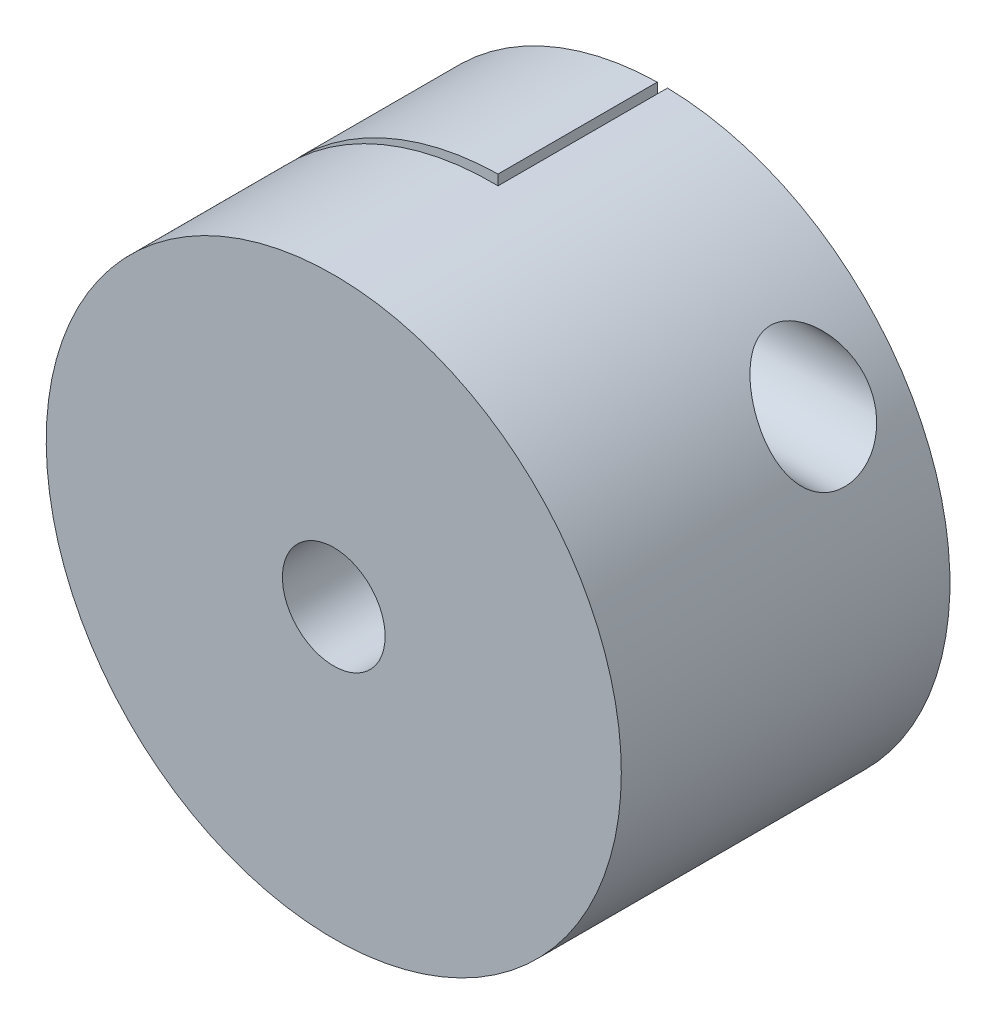
ISO-10303-21;
HEADER;
FILE_DESCRIPTION(('STEP AP214'),'2;1');
FILE_NAME('part.step','',(''),(''),'','','');
FILE_SCHEMA(('AUTOMOTIVE_DESIGN { 1 0 10303 214 1 1 1 1 }'));
ENDSEC;
DATA;
#1=APPLICATION_CONTEXT('core data for automotive mechanical design processes');
#2=APPLICATION_PROTOCOL_DEFINITION('international standard','automotive_design',2000,#1);
#3=PRODUCT_CONTEXT('',#1,'mechanical');
#4=PRODUCT('Part','Part','',(#3));
#5=PRODUCT_RELATED_PRODUCT_CATEGORY('part','',(#4));
#6=PRODUCT_DEFINITION_FORMATION('','',#4);
#7=PRODUCT_DEFINITION_CONTEXT('part definition',#1,'design');
#8=PRODUCT_DEFINITION('design','',#6,#7);
#9=PRODUCT_DEFINITION_SHAPE('','',#8);
#10=(LENGTH_UNIT() NAMED_UNIT(*) SI_UNIT(.MILLI.,.METRE.));
#11=(NAMED_UNIT(*) PLANE_ANGLE_UNIT() SI_UNIT($,.RADIAN.));
#12=(NAMED_UNIT(*) SI_UNIT($,.STERADIAN.) SOLID_ANGLE_UNIT());
#13=UNCERTAINTY_MEASURE_WITH_UNIT(LENGTH_MEASURE(1.E-05),#10,'distance_accuracy_value','');
#14=(GEOMETRIC_REPRESENTATION_CONTEXT(3) GLOBAL_UNCERTAINTY_ASSIGNED_CONTEXT((#13)) GLOBAL_UNIT_ASSIGNED_CONTEXT((#10,
#11,#12)) REPRESENTATION_CONTEXT('',''));
#15=CARTESIAN_POINT('',(0.,0.,0.));
#16=DIRECTION('',(0.,0.,1.));
#17=DIRECTION('',(1.,0.,0.));
#18=AXIS2_PLACEMENT_3D('',#15,#16,#17);
#19=CARTESIAN_POINT('',(0.,0.,16.));
#20=DIRECTION('',(0.,0.,-1.));
#21=DIRECTION('',(-1.,0.,0.));
#22=AXIS2_PLACEMENT_3D('',#19,#20,#21);
#23=CYLINDRICAL_SURFACE('',#22,14.);
#24=CARTESIAN_POINT('',(0.,0.,0.));
#25=DIRECTION('',(0.,0.,1.));
#26=DIRECTION('',(1.,0.,0.));
#27=AXIS2_PLACEMENT_3D('',#24,#25,#26);
#28=CIRCLE('',#27,14.);
#29=CARTESIAN_POINT('',(0.25,-13.9977676791694,0.));
#30=VERTEX_POINT('',#29);
#31=CARTESIAN_POINT('',(0.25,13.9977676791694,0.));
#32=VERTEX_POINT('',#31);
#33=EDGE_CURVE('E132',#30,#32,#28,.T.);
#34=ORIENTED_EDGE('',*,*,#33,.T.);
#35=DIRECTION('',(0.,0.,-1.));
#36=VECTOR('',#35,1.);
#37=CARTESIAN_POINT('',(0.25,13.9977676791694,16.));
#38=LINE('',#37,#36);
#39=CARTESIAN_POINT('',(0.25,13.9977676791694,8.25));
#40=VERTEX_POINT('',#39);
#41=EDGE_CURVE('E111',#32,#40,#38,.F.);
#42=ORIENTED_EDGE('',*,*,#41,.T.);
#43=CARTESIAN_POINT('',(0.,0.,8.25));
#44=DIRECTION('',(0.,0.,1.));
#45=DIRECTION('',(1.,0.,0.));
#46=AXIS2_PLACEMENT_3D('',#43,#44,#45);
#47=CIRCLE('',#46,14.);
#48=CARTESIAN_POINT('',(0.25,-13.9977676791694,8.25));
#49=VERTEX_POINT('',#48);
#50=EDGE_CURVE('E75',#40,#49,#47,.T.);
#51=ORIENTED_EDGE('',*,*,#50,.T.);
#52=DIRECTION('',(0.,0.,-1.));
#53=VECTOR('',#52,1.);
#54=CARTESIAN_POINT('',(0.25,-13.9977676791694,16.));
#55=LINE('',#54,#53);
#56=EDGE_CURVE('E159',#49,#30,#55,.T.);
#57=ORIENTED_EDGE('',*,*,#56,.T.);
#58=EDGE_LOOP('',(#34,#42,#51,#57));
#59=FACE_BOUND('',#58,.T.);
#60=CARTESIAN_POINT('',(0.,0.,16.));
#61=DIRECTION('',(0.,0.,1.));
#62=DIRECTION('',(1.,0.,0.));
#63=AXIS2_PLACEMENT_3D('',#60,#61,#62);
#64=CIRCLE('',#63,14.);
#65=CARTESIAN_POINT('',(14.,0.,16.));
#66=VERTEX_POINT('',#65);
#67=EDGE_CURVE('E130',#66,#66,#64,.T.);
#68=ORIENTED_EDGE('',*,*,#67,.F.);
#69=EDGE_LOOP('',(#68));
#70=FACE_BOUND('',#69,.T.);
#71=CARTESIAN_POINT('',(11.490679359813,7.99776767916942,6.5));
#72=CARTESIAN_POINT('',(11.5516656594137,7.91014606887652,6.49999977427061));
#73=CARTESIAN_POINT('',(11.6116583436791,7.82180919120801,6.49539303561917));
#74=CARTESIAN_POINT('',(11.7291450925166,7.64450565599221,6.47652064536594));
#75=CARTESIAN_POINT('',(11.7866392770675,7.55553902892478,6.46225545811235));
#76=CARTESIAN_POINT('',(11.8986790569685,7.37783618930757,6.42362377017787));
#77=CARTESIAN_POINT('',(11.9532229123917,7.28910014147872,6.39925138073861));
#78=CARTESIAN_POINT('',(12.0587890551472,7.11309695671485,6.34008118658348));
#79=CARTESIAN_POINT('',(12.1098132550163,7.02582904182223,6.30528909958802));
#80=CARTESIAN_POINT('',(12.2286390542672,6.8176328672165,6.20804281135958));
#81=CARTESIAN_POINT('',(12.2944319648484,6.69804424432183,6.14011125189402));
#82=CARTESIAN_POINT('',(12.4166200693322,6.46872860623871,5.98276428563153));
#83=CARTESIAN_POINT('',(12.4730246460502,6.3589917961842,5.89337054936041));
#84=CARTESIAN_POINT('',(12.5757346619295,6.15338837926624,5.69377739140728));
#85=CARTESIAN_POINT('',(12.6219873460278,6.0575950591131,5.58347459152025));
#86=CARTESIAN_POINT('',(12.7032432320941,5.88529806376817,5.34502176678515));
#87=CARTESIAN_POINT('',(12.7382486976531,5.80879050783358,5.21687534055776));
#88=CARTESIAN_POINT('',(12.7939289894745,5.68503129348182,4.95907383654407));
#89=CARTESIAN_POINT('',(12.8156138307096,5.63575898623461,4.83060421165262));
#90=CARTESIAN_POINT('',(12.8491716235662,5.55882843847037,4.5661416328464));
#91=CARTESIAN_POINT('',(12.8610483852078,5.531161805299,4.43015162220438));
#92=CARTESIAN_POINT('',(12.8745705603,5.49960965337461,4.16244776124576));
#93=CARTESIAN_POINT('',(12.8767347124105,5.4945185890745,4.03090056861671));
#94=CARTESIAN_POINT('',(12.8722443335233,5.50503040803543,3.76879895536095));
#95=CARTESIAN_POINT('',(12.8655911203334,5.5206301989249,3.638244389313));
#96=CARTESIAN_POINT('',(12.8436379237383,5.57150857110303,3.38364269854005));
#97=CARTESIAN_POINT('',(12.8284556161979,5.60651925614825,3.25953160763476));
#98=CARTESIAN_POINT('',(12.7896035677863,5.69458881709802,3.01931980347134));
#99=CARTESIAN_POINT('',(12.7659337068456,5.74764794832498,2.90321920356161));
#100=CARTESIAN_POINT('',(12.7097692219042,5.87080982317001,2.67992394589161));
#101=CARTESIAN_POINT('',(12.6771225980287,5.94120372309579,2.57292856441977));
#102=CARTESIAN_POINT('',(12.60353926892,6.09574504273581,2.37263332134107));
#103=CARTESIAN_POINT('',(12.5626012245077,6.17989468376852,2.27933567631233));
#104=CARTESIAN_POINT('',(12.470523962514,6.36373595678701,2.10342804494597));
#105=CARTESIAN_POINT('',(12.4189535277045,6.464021173486,2.02166627585752));
#106=CARTESIAN_POINT('',(12.3079816683031,6.6728991591424,1.87610016784093));
#107=CARTESIAN_POINT('',(12.2485775893457,6.78149473873935,1.81230193878533));
#108=CARTESIAN_POINT('',(12.1166782120661,7.01468092040007,1.69737884724094));
#109=CARTESIAN_POINT('',(12.0434691316834,7.13979080554245,1.64813337765568));
#110=CARTESIAN_POINT('',(11.8901702654704,7.39227392218546,1.57083600729054));
#111=CARTESIAN_POINT('',(11.8100772015483,7.51964820881863,1.54279426650651));
#112=CARTESIAN_POINT('',(11.6325437876849,7.79191550970663,1.50417415204731));
#113=CARTESIAN_POINT('',(11.5342642343268,7.93669672006801,1.49668298741879));
#114=CARTESIAN_POINT('',(11.3327181073019,8.22192694311646,1.505977495735));
#115=CARTESIAN_POINT('',(11.229448361156,8.3623731043365,1.52277881405532));
#116=CARTESIAN_POINT('',(11.003178215464,8.65852788656441,1.58343584746153));
#117=CARTESIAN_POINT('',(10.8796771437855,8.81305523550111,1.63121038483806));
#118=CARTESIAN_POINT('',(10.6322438427212,9.11003756455905,1.75527442930803));
#119=CARTESIAN_POINT('',(10.5083113512405,9.25248298610465,1.83158626013388));
#120=CARTESIAN_POINT('',(10.2741113434714,9.51160802947413,2.00484993140763));
#121=CARTESIAN_POINT('',(10.1635415975784,9.62943617707022,2.09967397241966));
#122=CARTESIAN_POINT('',(9.95040854961326,9.84950142055011,2.31341803480738));
#123=CARTESIAN_POINT('',(9.84783210231968,9.95176438971519,2.43229728662166));
#124=CARTESIAN_POINT('',(9.68803253788483,10.1069416056333,2.65338353815194));
#125=CARTESIAN_POINT('',(9.62675277619245,10.1652132046545,2.74889220979241));
#126=CARTESIAN_POINT('',(9.51463875715464,10.2702248931958,2.95170269450118));
#127=CARTESIAN_POINT('',(9.46378804645504,10.3169831704151,3.05898551510927));
#128=CARTESIAN_POINT('',(9.38539865707228,10.3882887046595,3.26204362547364));
#129=CARTESIAN_POINT('',(9.35523767402674,10.4154007174676,3.35589077535247));
#130=CARTESIAN_POINT('',(9.30676259862039,10.4587398835682,3.5490243244324));
#131=CARTESIAN_POINT('',(9.28843716058832,10.4749774617551,3.64830541524889));
#132=CARTESIAN_POINT('',(9.26540924170529,10.4953535772014,3.85028843754386));
#133=CARTESIAN_POINT('',(9.26078432571755,10.4994232275111,3.95300652916053));
#134=CARTESIAN_POINT('',(9.26592762257144,10.4948842005682,4.15779868241144));
#135=CARTESIAN_POINT('',(9.27569696033032,10.4862745324213,4.25987269308438));
#136=CARTESIAN_POINT('',(9.30712051026686,10.4583883379419,4.45160794560922));
#137=CARTESIAN_POINT('',(9.32770904072049,10.4400671623926,4.54159217771498));
#138=CARTESIAN_POINT('',(9.37834434930877,10.3946050589235,4.71648350887695));
#139=CARTESIAN_POINT('',(9.40839550926472,10.367460044796,4.80138823406757));
#140=CARTESIAN_POINT('',(9.49239223985164,10.2907266887185,5.00456106869));
#141=CARTESIAN_POINT('',(9.55087952205689,10.2366225502855,5.11924457311828));
#142=CARTESIAN_POINT('',(9.67919210954529,10.1153882900802,5.33455283214644));
#143=CARTESIAN_POINT('',(9.74904599826674,10.0482252440454,5.4351409224998));
#144=CARTESIAN_POINT('',(9.92532515621357,9.8746444814084,5.65973697161649));
#145=CARTESIAN_POINT('',(10.035243095848,9.7632405124862,5.77713961642322));
#146=CARTESIAN_POINT('',(10.2621216180487,9.52450134695279,5.9860208119408));
#147=CARTESIAN_POINT('',(10.3790919446213,9.3971438336171,6.07746244987957));
#148=CARTESIAN_POINT('',(10.6183064463305,9.12606542907405,6.23657037082035));
#149=CARTESIAN_POINT('',(10.7406093284653,8.98201448888971,6.30358352087646));
#150=CARTESIAN_POINT('',(10.9836060445354,8.68316219158734,6.40940897590127));
#151=CARTESIAN_POINT('',(11.1043033747767,8.52839144239665,6.44829821764277));
#152=CARTESIAN_POINT('',(11.268054353382,8.30883770751086,6.4813371586051));
#153=CARTESIAN_POINT('',(11.3131593009052,8.24731960583774,6.4882906439976));
#154=CARTESIAN_POINT('',(11.4025740453025,8.12324722986067,6.49762465794899));
#155=CARTESIAN_POINT('',(11.4468829157137,8.0606918930046,6.50000016210435));
#156=CARTESIAN_POINT('',(11.490679359813,7.99776767916942,6.5));
#157=B_SPLINE_CURVE_WITH_KNOTS('',3,(#71,#72,#73,#74,#75,#76,#77,#78,#79,#80,#81,#82,#83,#84,
#85,#86,#87,#88,#89,#90,#91,#92,#93,#94,#95,#96,#97,#98,#99,#100,#101,#102,#103,#104,#105,#106,
#107,#108,#109,#110,#111,#112,#113,#114,#115,#116,#117,#118,#119,#120,#121,#122,#123,#124,#125,
#126,#127,#128,#129,#130,#131,#132,#133,#134,#135,#136,#137,#138,#139,#140,#141,#142,#143,#144,
#145,#146,#147,#148,#149,#150,#151,#152,#153,#154,#155,#156),.UNSPECIFIED.,.T.,.F.,(4,2,2,2,2,2,
2,2,2,2,2,2,2,2,2,2,2,2,2,2,2,2,2,2,2,2,2,2,2,2,2,2,2,2,2,2,2,2,2,2,2,2,4),(0.,
0.320183643268509,0.640351894195072,0.960706947386618,1.28088652956916,1.73620817337135,
2.19107199470473,2.64824634716572,3.10532863198247,3.52105665322652,3.93662310582452,
4.3297081682848,4.72273448846018,5.11046689082658,5.4982047784791,5.89296199426746,
6.28778301972679,6.70390588940507,7.12017012291831,7.57763535541176,8.03531964865485,
8.55874932210159,9.0825162563604,9.69057509806223,10.2991106014745,10.8591819843958,
11.4183119729261,11.7998421925637,12.1807657819949,12.4862577053998,12.7914563448307,
13.0983795808129,13.4053268042532,13.6865263227205,13.9678562470705,14.3844403354132,
14.8020886676371,15.3859084256891,15.9705541800215,16.569849030842,17.1674981627527,
17.3971815567988,17.6271168885989),.UNSPECIFIED.);
#158=CARTESIAN_POINT('',(11.490679359813,7.99776767916942,6.5));
#159=VERTEX_POINT('',#158);
#160=EDGE_CURVE('E57',#159,#159,#157,.T.);
#161=ORIENTED_EDGE('',*,*,#160,.F.);
#162=EDGE_LOOP('',(#161));
#163=FACE_BOUND('',#162,.T.);
#164=ADVANCED_FACE('F53',(#59,#70,#163),#23,.T.);
#165=CARTESIAN_POINT('',(-14.,7.99776767916942,4.));
#166=DIRECTION('',(1.,0.,0.));
#167=DIRECTION('',(0.,0.,-1.));
#168=AXIS2_PLACEMENT_3D('',#165,#166,#167);
#169=CYLINDRICAL_SURFACE('',#168,1.5);
#170=CARTESIAN_POINT('',(0.25,7.99776767916942,4.));
#171=DIRECTION('',(1.,0.,0.));
#172=DIRECTION('',(0.,0.,-1.));
#173=AXIS2_PLACEMENT_3D('',#170,#171,#172);
#174=CIRCLE('',#173,1.5);
#175=CARTESIAN_POINT('',(0.25,7.99776767916942,2.5));
#176=VERTEX_POINT('',#175);
#177=EDGE_CURVE('E133',#176,#176,#174,.T.);
#178=ORIENTED_EDGE('',*,*,#177,.F.);
#179=EDGE_LOOP('',(#178));
#180=FACE_BOUND('',#179,.T.);
#181=CARTESIAN_POINT('',(3.,7.99776767916942,4.));
#182=DIRECTION('',(1.,0.,0.));
#183=DIRECTION('',(0.,0.,-1.));
#184=AXIS2_PLACEMENT_3D('',#181,#182,#183);
#185=CIRCLE('',#184,1.5);
#186=CARTESIAN_POINT('',(3.,7.99776767916942,2.5));
#187=VERTEX_POINT('',#186);
#188=EDGE_CURVE('E146',#187,#187,#185,.T.);
#189=ORIENTED_EDGE('',*,*,#188,.T.);
#190=EDGE_LOOP('',(#189));
#191=FACE_BOUND('',#190,.T.);
#192=ADVANCED_FACE('F183',(#180,#191),#169,.F.);
#193=CARTESIAN_POINT('',(0.,0.,16.));
#194=DIRECTION('',(0.,0.,1.));
#195=DIRECTION('',(1.,0.,0.));
#196=AXIS2_PLACEMENT_3D('',#193,#194,#195);
#197=PLANE('',#196);
#198=ORIENTED_EDGE('',*,*,#67,.T.);
#199=EDGE_LOOP('',(#198));
#200=FACE_BOUND('',#199,.T.);
#201=CARTESIAN_POINT('',(0.,0.,16.));
#202=DIRECTION('',(0.,0.,1.));
#203=DIRECTION('',(1.,0.,0.));
#204=AXIS2_PLACEMENT_3D('',#201,#202,#203);
#205=CIRCLE('',#204,2.5);
#206=CARTESIAN_POINT('',(2.5,0.,16.));
#207=VERTEX_POINT('',#206);
#208=EDGE_CURVE('E117',#207,#207,#205,.T.);
#209=ORIENTED_EDGE('',*,*,#208,.F.);
#210=EDGE_LOOP('',(#209));
#211=FACE_BOUND('',#210,.T.);
#212=ADVANCED_FACE('F187',(#200,#211),#197,.T.);
#213=CARTESIAN_POINT('',(0.,0.,0.));
#214=DIRECTION('',(0.,0.,1.));
#215=DIRECTION('',(1.,0.,0.));
#216=AXIS2_PLACEMENT_3D('',#213,#214,#215);
#217=PLANE('',#216);
#218=ORIENTED_EDGE('',*,*,#33,.F.);
#219=DIRECTION('',(0.,1.,0.));
#220=VECTOR('',#219,1.);
#221=CARTESIAN_POINT('',(0.25,-14.,0.));
#222=LINE('',#221,#220);
#223=CARTESIAN_POINT('',(0.25,-2.48746859276655,0.));
#224=VERTEX_POINT('',#223);
#225=EDGE_CURVE('E82',#30,#224,#222,.T.);
#226=ORIENTED_EDGE('',*,*,#225,.T.);
#227=CARTESIAN_POINT('',(0.,0.,0.));
#228=DIRECTION('',(0.,0.,1.));
#229=DIRECTION('',(1.,0.,0.));
#230=AXIS2_PLACEMENT_3D('',#227,#228,#229);
#231=CIRCLE('',#230,2.5);
#232=CARTESIAN_POINT('',(0.25,2.48746859276655,0.));
#233=VERTEX_POINT('',#232);
#234=EDGE_CURVE('E118',#224,#233,#231,.T.);
#235=ORIENTED_EDGE('',*,*,#234,.T.);
#236=EDGE_CURVE('E107',#233,#32,#222,.T.);
#237=ORIENTED_EDGE('',*,*,#236,.T.);
#238=EDGE_LOOP('',(#218,#226,#235,#237));
#239=FACE_BOUND('',#238,.T.);
#240=ADVANCED_FACE('F55',(#239),#217,.F.);
#241=CARTESIAN_POINT('',(0.,0.,16.));
#242=DIRECTION('',(0.,0.,-1.));
#243=DIRECTION('',(-1.,0.,0.));
#244=AXIS2_PLACEMENT_3D('',#241,#242,#243);
#245=CYLINDRICAL_SURFACE('',#244,2.5);
#246=DIRECTION('',(0.,0.,-1.));
#247=VECTOR('',#246,1.);
#248=CARTESIAN_POINT('',(0.25,-2.48746859276655,16.));
#249=LINE('',#248,#247);
#250=CARTESIAN_POINT('',(0.25,-2.48746859276655,8.25));
#251=VERTEX_POINT('',#250);
#252=EDGE_CURVE('E12',#251,#224,#249,.T.);
#253=ORIENTED_EDGE('',*,*,#252,.F.);
#254=CARTESIAN_POINT('',(0.,0.,8.25));
#255=DIRECTION('',(0.,0.,1.));
#256=DIRECTION('',(1.,0.,0.));
#257=AXIS2_PLACEMENT_3D('',#254,#255,#256);
#258=CIRCLE('',#257,2.5);
#259=CARTESIAN_POINT('',(0.25,2.48746859276655,8.25));
#260=VERTEX_POINT('',#259);
#261=EDGE_CURVE('E96',#260,#251,#258,.T.);
#262=ORIENTED_EDGE('',*,*,#261,.F.);
#263=DIRECTION('',(0.,0.,-1.));
#264=VECTOR('',#263,1.);
#265=CARTESIAN_POINT('',(0.25,2.48746859276655,16.));
#266=LINE('',#265,#264);
#267=EDGE_CURVE('E110',#233,#260,#266,.F.);
#268=ORIENTED_EDGE('',*,*,#267,.F.);
#269=ORIENTED_EDGE('',*,*,#234,.F.);
#270=EDGE_LOOP('',(#253,#262,#268,#269));
#271=FACE_BOUND('',#270,.T.);
#272=ORIENTED_EDGE('',*,*,#208,.T.);
#273=EDGE_LOOP('',(#272));
#274=FACE_BOUND('',#273,.T.);
#275=ADVANCED_FACE('F123',(#271,#274),#245,.F.);
#276=CARTESIAN_POINT('',(-14.,-14.,8.25));
#277=DIRECTION('',(0.,0.,1.));
#278=DIRECTION('',(1.,0.,0.));
#279=AXIS2_PLACEMENT_3D('',#276,#277,#278);
#280=PLANE('',#279);
#281=DIRECTION('',(0.,1.,0.));
#282=VECTOR('',#281,1.);
#283=CARTESIAN_POINT('',(0.25,-14.,8.25));
#284=LINE('',#283,#282);
#285=EDGE_CURVE('E100',#260,#40,#284,.T.);
#286=ORIENTED_EDGE('',*,*,#285,.F.);
#287=ORIENTED_EDGE('',*,*,#261,.T.);
#288=EDGE_CURVE('E67',#49,#251,#284,.T.);
#289=ORIENTED_EDGE('',*,*,#288,.F.);
#290=ORIENTED_EDGE('',*,*,#50,.F.);
#291=EDGE_LOOP('',(#286,#287,#289,#290));
#292=FACE_BOUND('',#291,.T.);
#293=ADVANCED_FACE('F172',(#292),#280,.F.);
#294=CARTESIAN_POINT('',(0.25,-14.,8.25));
#295=DIRECTION('',(1.,0.,0.));
#296=DIRECTION('',(0.,0.,-1.));
#297=AXIS2_PLACEMENT_3D('',#294,#295,#296);
#298=PLANE('',#297);
#299=ORIENTED_EDGE('',*,*,#177,.T.);
#300=EDGE_LOOP('',(#299));
#301=FACE_BOUND('',#300,.T.);
#302=ORIENTED_EDGE('',*,*,#236,.F.);
#303=ORIENTED_EDGE('',*,*,#267,.T.);
#304=ORIENTED_EDGE('',*,*,#285,.T.);
#305=ORIENTED_EDGE('',*,*,#41,.F.);
#306=EDGE_LOOP('',(#302,#303,#304,#305));
#307=FACE_BOUND('',#306,.T.);
#308=ADVANCED_FACE('F109',(#301,#307),#298,.F.);
#309=ORIENTED_EDGE('',*,*,#288,.T.);
#310=ORIENTED_EDGE('',*,*,#252,.T.);
#311=ORIENTED_EDGE('',*,*,#225,.F.);
#312=ORIENTED_EDGE('',*,*,#56,.F.);
#313=EDGE_LOOP('',(#309,#310,#311,#312));
#314=FACE_BOUND('',#313,.T.);
#315=ADVANCED_FACE('F171',(#314),#298,.F.);
#316=CARTESIAN_POINT('',(14.,7.99776767916942,4.));
#317=DIRECTION('',(-1.,0.,0.));
#318=DIRECTION('',(0.,0.,1.));
#319=AXIS2_PLACEMENT_3D('',#316,#317,#318);
#320=CYLINDRICAL_SURFACE('',#319,2.5);
#321=CARTESIAN_POINT('',(3.,7.99776767916942,4.));
#322=DIRECTION('',(1.,0.,0.));
#323=DIRECTION('',(0.,0.,-1.));
#324=AXIS2_PLACEMENT_3D('',#321,#322,#323);
#325=CIRCLE('',#324,2.5);
#326=CARTESIAN_POINT('',(3.,7.99776767916942,1.5));
#327=VERTEX_POINT('',#326);
#328=EDGE_CURVE('E141',#327,#327,#325,.T.);
#329=ORIENTED_EDGE('',*,*,#328,.F.);
#330=EDGE_LOOP('',(#329));
#331=FACE_BOUND('',#330,.T.);
#332=ORIENTED_EDGE('',*,*,#160,.T.);
#333=EDGE_LOOP('',(#332));
#334=FACE_BOUND('',#333,.T.);
#335=ADVANCED_FACE('F193',(#331,#334),#320,.F.);
#336=CARTESIAN_POINT('',(3.,7.99776767916942,4.));
#337=DIRECTION('',(1.,0.,0.));
#338=DIRECTION('',(0.,0.,-1.));
#339=AXIS2_PLACEMENT_3D('',#336,#337,#338);
#340=PLANE('',#339);
#341=ORIENTED_EDGE('',*,*,#328,.T.);
#342=EDGE_LOOP('',(#341));
#343=FACE_BOUND('',#342,.T.);
#344=ORIENTED_EDGE('',*,*,#188,.F.);
#345=EDGE_LOOP('',(#344));
#346=FACE_BOUND('',#345,.T.);
#347=ADVANCED_FACE('F197',(#343,#346),#340,.T.);
#348=CLOSED_SHELL('',(#164,#192,#212,#240,#275,#293,#308,#315,#335,#347));
#349=MANIFOLD_SOLID_BREP('B2',#348);
#350=CARTESIAN_POINT('',(0.,0.,16.));
#351=DIRECTION('',(0.,0.,-1.));
#352=DIRECTION('',(-1.,0.,0.));
#353=AXIS2_PLACEMENT_3D('',#350,#351,#352);
#354=CYLINDRICAL_SURFACE('',#353,2.5);
#355=DIRECTION('',(0.,0.,-1.));
#356=VECTOR('',#355,1.);
#357=CARTESIAN_POINT('',(-0.249999999999999,2.48746859276655,16.));
#358=LINE('',#357,#356);
#359=CARTESIAN_POINT('',(-0.249999999999999,2.48746859276655,7.75));
#360=VERTEX_POINT('',#359);
#361=CARTESIAN_POINT('',(-0.25,2.48746859276655,0.));
#362=VERTEX_POINT('',#361);
#363=EDGE_CURVE('E51',#360,#362,#358,.T.);
#364=ORIENTED_EDGE('',*,*,#363,.F.);
#365=CARTESIAN_POINT('',(0.,0.,7.75));
#366=DIRECTION('',(0.,0.,-1.));
#367=DIRECTION('',(-1.,0.,0.));
#368=AXIS2_PLACEMENT_3D('',#365,#366,#367);
#369=CIRCLE('',#368,2.5);
#370=CARTESIAN_POINT('',(-0.249999999999999,-2.48746859276655,7.75));
#371=VERTEX_POINT('',#370);
#372=EDGE_CURVE('E298',#371,#360,#369,.T.);
#373=ORIENTED_EDGE('',*,*,#372,.F.);
#374=DIRECTION('',(0.,0.,-1.));
#375=VECTOR('',#374,1.);
#376=CARTESIAN_POINT('',(-0.249999999999999,-2.48746859276655,16.));
#377=LINE('',#376,#375);
#378=CARTESIAN_POINT('',(-0.25,-2.48746859276655,0.));
#379=VERTEX_POINT('',#378);
#380=EDGE_CURVE('E347',#379,#371,#377,.F.);
#381=ORIENTED_EDGE('',*,*,#380,.F.);
#382=CARTESIAN_POINT('',(0.,0.,0.));
#383=DIRECTION('',(0.,0.,1.));
#384=DIRECTION('',(1.,0.,0.));
#385=AXIS2_PLACEMENT_3D('',#382,#383,#384);
#386=CIRCLE('',#385,2.5);
#387=EDGE_CURVE('E343',#362,#379,#386,.T.);
#388=ORIENTED_EDGE('',*,*,#387,.F.);
#389=EDGE_LOOP('',(#364,#373,#381,#388));
#390=FACE_BOUND('',#389,.T.);
#391=ADVANCED_FACE('F288',(#390),#354,.F.);
#392=CARTESIAN_POINT('',(0.,0.,16.));
#393=DIRECTION('',(0.,0.,-1.));
#394=DIRECTION('',(-1.,0.,0.));
#395=AXIS2_PLACEMENT_3D('',#392,#393,#394);
#396=CYLINDRICAL_SURFACE('',#395,14.);
#397=CARTESIAN_POINT('',(-11.490679359813,7.99776767916942,2.5));
#398=CARTESIAN_POINT('',(-11.4179331705252,8.10228251228951,2.50000043473908));
#399=CARTESIAN_POINT('',(-11.3437427712539,8.20580582956691,2.51091197034802));
#400=CARTESIAN_POINT('',(-11.194641874841,8.40808045898997,2.55350594783422));
#401=CARTESIAN_POINT('',(-11.1197306717029,8.50682636378036,2.58521136095123));
#402=CARTESIAN_POINT('',(-10.9717025303421,8.69691099418625,2.66883744956241));
#403=CARTESIAN_POINT('',(-10.8985861089538,8.78824760323684,2.72076387706085));
#404=CARTESIAN_POINT('',(-10.7574162030731,8.96048655226909,2.84483802733673));
#405=CARTESIAN_POINT('',(-10.6893526176702,9.04140996025172,2.91694395311992));
#406=CARTESIAN_POINT('',(-10.5843520031706,9.16382348645025,3.05361397447309));
#407=CARTESIAN_POINT('',(-10.544682395853,9.20938437318157,3.11245545579624));
#408=CARTESIAN_POINT('',(-10.4714626189687,9.29255197861002,3.23892265967011));
#409=CARTESIAN_POINT('',(-10.4379026752949,9.33017141752627,3.30653405016461));
#410=CARTESIAN_POINT('',(-10.3845493115163,9.38948540782105,3.43673695201789));
#411=CARTESIAN_POINT('',(-10.3633616733568,9.4128326871136,3.49799807036351));
#412=CARTESIAN_POINT('',(-10.3279936874624,9.45162631201994,3.62491746564926));
#413=CARTESIAN_POINT('',(-10.3138086341291,9.46707796358497,3.69057275601149));
#414=CARTESIAN_POINT('',(-10.2935604929701,9.48909089428347,3.82502102604751));
#415=CARTESIAN_POINT('',(-10.2875454060973,9.49559963374782,3.89383011488929));
#416=CARTESIAN_POINT('',(-10.2843912867214,9.49901593765675,4.03188746724893));
#417=CARTESIAN_POINT('',(-10.2872501135025,9.49592581770056,4.10113562082614));
#418=CARTESIAN_POINT('',(-10.3008583473552,9.48116018316584,4.23112398092475));
#419=CARTESIAN_POINT('',(-10.3108317571619,9.47032881242325,4.29204715157822));
#420=CARTESIAN_POINT('',(-10.3370439015046,9.44171049554827,4.41080753666845));
#421=CARTESIAN_POINT('',(-10.353283780578,9.42392227877676,4.46864418517037));
#422=CARTESIAN_POINT('',(-10.3923552685729,9.38082348973207,4.58414001326673));
#423=CARTESIAN_POINT('',(-10.4155686378421,9.35507361427678,4.64150353394592));
#424=CARTESIAN_POINT('',(-10.4667769621284,9.29774499981334,4.75092086602498));
#425=CARTESIAN_POINT('',(-10.4947756228409,9.26616174193517,4.80297051212272));
#426=CARTESIAN_POINT('',(-10.570229328823,9.18014185107555,4.92756023347018));
#427=CARTESIAN_POINT('',(-10.6201434091725,9.12245222306357,4.99638017926407));
#428=CARTESIAN_POINT('',(-10.7253991613595,8.99846973109727,5.12086612172606));
#429=CARTESIAN_POINT('',(-10.7807503936029,8.93216164428054,5.1765083396901));
#430=CARTESIAN_POINT('',(-10.8956038661925,8.79171119317087,5.27560332225408));
#431=CARTESIAN_POINT('',(-10.9551624300202,8.71745045550524,5.31882166016195));
#432=CARTESIAN_POINT('',(-11.0757314063156,8.56374501150859,5.39172774632739));
#433=CARTESIAN_POINT('',(-11.1367415171343,8.48430137637025,5.42141828042508));
#434=CARTESIAN_POINT('',(-11.2707648137626,8.3056968635891,5.47152124659353));
#435=CARTESIAN_POINT('',(-11.3437988312124,8.20571183270692,5.48899571649325));
#436=CARTESIAN_POINT('',(-11.487912428622,8.00271069892993,5.50344125941125));
#437=CARTESIAN_POINT('',(-11.5589900611139,7.89969177306738,5.50039259483316));
#438=CARTESIAN_POINT('',(-11.6976084363918,7.69295479717623,5.472431192496));
#439=CARTESIAN_POINT('',(-11.7651174428816,7.58923752741813,5.44734892652965));
#440=CARTESIAN_POINT('',(-11.8936448079312,7.3861746209804,5.37388286595137));
#441=CARTESIAN_POINT('',(-11.9546763938698,7.28682032803338,5.32554771828303));
#442=CARTESIAN_POINT('',(-12.051945498388,7.12439098228816,5.2221758972293));
#443=CARTESIAN_POINT('',(-12.0903343862386,7.05895967857897,5.1728269830232));
#444=CARTESIAN_POINT('',(-12.1615861276621,6.93548033891278,5.06226081191781));
#445=CARTESIAN_POINT('',(-12.1944518213362,6.87742851209303,5.00104968980834));
#446=CARTESIAN_POINT('',(-12.2538830955826,6.77097506136821,4.86736477475574));
#447=CARTESIAN_POINT('',(-12.2804113462377,6.72263087273032,4.79482821735036));
#448=CARTESIAN_POINT('',(-12.3260343393124,6.63861273681669,4.64061840210928));
#449=CARTESIAN_POINT('',(-12.3451327356984,6.60293256219868,4.55894966094469));
#450=CARTESIAN_POINT('',(-12.3736193066078,6.54937932336721,4.39821684273215));
#451=CARTESIAN_POINT('',(-12.3838201741653,6.53002322819768,4.31978911896731));
#452=CARTESIAN_POINT('',(-12.3974177785559,6.50417201187225,4.16027828577922));
#453=CARTESIAN_POINT('',(-12.4008178840043,6.49767052347392,4.07919651122364));
#454=CARTESIAN_POINT('',(-12.4007178534466,6.49786047505432,3.9225798628851));
#455=CARTESIAN_POINT('',(-12.3976700770702,6.50368702826499,3.84704175866509));
#456=CARTESIAN_POINT('',(-12.3856647835023,6.52652069114148,3.69817038503741));
#457=CARTESIAN_POINT('',(-12.3767079602769,6.54352648790162,3.62483685777867));
#458=CARTESIAN_POINT('',(-12.3531656467647,6.58786153588353,3.482604970008));
#459=CARTESIAN_POINT('',(-12.3385987334383,6.61515670914554,3.41369283818992));
#460=CARTESIAN_POINT('',(-12.3042068160009,6.67890717892593,3.28168005167123));
#461=CARTESIAN_POINT('',(-12.2843809232761,6.71536402344405,3.21858038153658));
#462=CARTESIAN_POINT('',(-12.2387326297201,6.79821829330044,3.09621213454899));
#463=CARTESIAN_POINT('',(-12.212643515614,6.84504731366519,3.03733641141226));
#464=CARTESIAN_POINT('',(-12.1557642447067,6.94555467573975,2.9283900467556));
#465=CARTESIAN_POINT('',(-12.1249725820114,6.99923521059796,2.87832223687963));
#466=CARTESIAN_POINT('',(-12.0559421692131,7.11754219931813,2.78280539663294));
#467=CARTESIAN_POINT('',(-12.0172626981798,7.1827265460275,2.73836790934828));
#468=CARTESIAN_POINT('',(-11.9358388931532,7.31723635648266,2.66100465831387));
#469=CARTESIAN_POINT('',(-11.8930921074131,7.38656430848073,2.62808589459937));
#470=CARTESIAN_POINT('',(-11.7931392989811,7.54537689177382,2.56671725352431));
#471=CARTESIAN_POINT('',(-11.7350074615584,7.63553147817255,2.54149385979322));
#472=CARTESIAN_POINT('',(-11.6151711267725,7.81662565205505,2.50812648006269));
#473=CARTESIAN_POINT('',(-11.5534631096144,7.90756593530655,2.49999962479754));
#474=CARTESIAN_POINT('',(-11.490679359813,7.99776767916942,2.5));
#475=B_SPLINE_CURVE_WITH_KNOTS('',3,(#397,#398,#399,#400,#401,#402,#403,#404,#405,#406,#407,
#408,#409,#410,#411,#412,#413,#414,#415,#416,#417,#418,#419,#420,#421,#422,#423,#424,#425,#426,
#427,#428,#429,#430,#431,#432,#433,#434,#435,#436,#437,#438,#439,#440,#441,#442,#443,#444,#445,
#446,#447,#448,#449,#450,#451,#452,#453,#454,#455,#456,#457,#458,#459,#460,#461,#462,#463,#464,
#465,#466,#467,#468,#469,#470,#471,#472,#473,#474),.UNSPECIFIED.,.T.,.F.,(4,2,2,2,2,2,2,2,2,2,2,
2,2,2,2,2,2,2,2,2,2,2,2,2,2,2,2,2,2,2,2,2,2,2,2,2,2,2,4),(0.,0.3816147203654,0.763651726691513,
1.14579748550319,1.5271575056755,1.77930282078532,2.03104114500531,2.23690593997275,
2.44263220892518,2.64956202636015,2.85644192856162,3.04365373764745,3.23089975617603,
3.43124929596556,3.63175469385895,3.93829230678961,4.24537891094262,4.55792785842481,
4.87041241220382,5.24382770417562,5.61760216996404,5.99427792368221,6.37016904522528,
6.64056759017498,6.91082666424955,7.18264044207329,7.45432037369258,7.69729813849505,
7.94015551950594,8.16654139954472,8.39290069726445,8.61851679734965,8.84417104427,
9.08205245956951,9.32001021183391,9.58255146596981,9.84525199289384,10.1742758449119,
10.5036292221607),.UNSPECIFIED.);
#476=CARTESIAN_POINT('',(-11.490679359813,7.99776767916942,2.5));
#477=VERTEX_POINT('',#476);
#478=EDGE_CURVE('E389',#477,#477,#475,.T.);
#479=ORIENTED_EDGE('',*,*,#478,.T.);
#480=EDGE_LOOP('',(#479));
#481=FACE_BOUND('',#480,.T.);
#482=CARTESIAN_POINT('',(0.,0.,7.75));
#483=DIRECTION('',(0.,0.,-1.));
#484=DIRECTION('',(-1.,0.,0.));
#485=AXIS2_PLACEMENT_3D('',#482,#483,#484);
#486=CIRCLE('',#485,14.);
#487=CARTESIAN_POINT('',(-0.249999999999999,-13.9977676791694,7.75));
#488=VERTEX_POINT('',#487);
#489=CARTESIAN_POINT('',(-0.249999999999999,13.9977676791694,7.75));
#490=VERTEX_POINT('',#489);
#491=EDGE_CURVE('E313',#488,#490,#486,.T.);
#492=ORIENTED_EDGE('',*,*,#491,.T.);
#493=DIRECTION('',(0.,0.,-1.));
#494=VECTOR('',#493,1.);
#495=CARTESIAN_POINT('',(-0.249999999999999,13.9977676791694,16.));
#496=LINE('',#495,#494);
#497=CARTESIAN_POINT('',(-0.25,13.9977676791694,0.));
#498=VERTEX_POINT('',#497);
#499=EDGE_CURVE('E334',#490,#498,#496,.T.);
#500=ORIENTED_EDGE('',*,*,#499,.T.);
#501=CARTESIAN_POINT('',(0.,0.,0.));
#502=DIRECTION('',(0.,0.,1.));
#503=DIRECTION('',(1.,0.,0.));
#504=AXIS2_PLACEMENT_3D('',#501,#502,#503);
#505=CIRCLE('',#504,14.);
#506=CARTESIAN_POINT('',(-0.25,-13.9977676791694,0.));
#507=VERTEX_POINT('',#506);
#508=EDGE_CURVE('E341',#498,#507,#505,.T.);
#509=ORIENTED_EDGE('',*,*,#508,.T.);
#510=DIRECTION('',(0.,0.,-1.));
#511=VECTOR('',#510,1.);
#512=CARTESIAN_POINT('',(-0.249999999999999,-13.9977676791694,16.));
#513=LINE('',#512,#511);
#514=EDGE_CURVE('E329',#507,#488,#513,.F.);
#515=ORIENTED_EDGE('',*,*,#514,.T.);
#516=EDGE_LOOP('',(#492,#500,#509,#515));
#517=FACE_BOUND('',#516,.T.);
#518=ADVANCED_FACE('F290',(#481,#517),#396,.T.);
#519=CARTESIAN_POINT('',(0.,0.,0.));
#520=DIRECTION('',(0.,0.,1.));
#521=DIRECTION('',(1.,0.,0.));
#522=AXIS2_PLACEMENT_3D('',#519,#520,#521);
#523=PLANE('',#522);
#524=ORIENTED_EDGE('',*,*,#508,.F.);
#525=DIRECTION('',(0.,1.,0.));
#526=VECTOR('',#525,1.);
#527=CARTESIAN_POINT('',(-0.25,-14.,0.));
#528=LINE('',#527,#526);
#529=EDGE_CURVE('E345',#362,#498,#528,.T.);
#530=ORIENTED_EDGE('',*,*,#529,.F.);
#531=ORIENTED_EDGE('',*,*,#387,.T.);
#532=EDGE_CURVE('E305',#507,#379,#528,.T.);
#533=ORIENTED_EDGE('',*,*,#532,.F.);
#534=EDGE_LOOP('',(#524,#530,#531,#533));
#535=FACE_BOUND('',#534,.T.);
#536=ADVANCED_FACE('F339',(#535),#523,.F.);
#537=CARTESIAN_POINT('',(-0.249999999999999,-14.,7.75));
#538=DIRECTION('',(0.,0.,-1.));
#539=DIRECTION('',(-1.,0.,0.));
#540=AXIS2_PLACEMENT_3D('',#537,#538,#539);
#541=PLANE('',#540);
#542=ORIENTED_EDGE('',*,*,#491,.F.);
#543=DIRECTION('',(0.,1.,0.));
#544=VECTOR('',#543,1.);
#545=CARTESIAN_POINT('',(-0.249999999999999,-14.,7.75));
#546=LINE('',#545,#544);
#547=EDGE_CURVE('E332',#488,#371,#546,.T.);
#548=ORIENTED_EDGE('',*,*,#547,.T.);
#549=ORIENTED_EDGE('',*,*,#372,.T.);
#550=EDGE_CURVE('E344',#360,#490,#546,.T.);
#551=ORIENTED_EDGE('',*,*,#550,.T.);
#552=EDGE_LOOP('',(#542,#548,#549,#551));
#553=FACE_BOUND('',#552,.T.);
#554=ADVANCED_FACE('F357',(#553),#541,.F.);
#555=CARTESIAN_POINT('',(-0.25,-14.,0.));
#556=DIRECTION('',(-1.,0.,0.));
#557=DIRECTION('',(0.,0.,1.));
#558=AXIS2_PLACEMENT_3D('',#555,#556,#557);
#559=PLANE('',#558);
#560=CARTESIAN_POINT('',(-0.25,7.99776767916942,4.));
#561=DIRECTION('',(-1.,0.,0.));
#562=DIRECTION('',(0.,0.,1.));
#563=AXIS2_PLACEMENT_3D('',#560,#561,#562);
#564=CIRCLE('',#563,1.5);
#565=CARTESIAN_POINT('',(-0.25,7.99776767916942,5.5));
#566=VERTEX_POINT('',#565);
#567=EDGE_CURVE('E293',#566,#566,#564,.T.);
#568=ORIENTED_EDGE('',*,*,#567,.T.);
#569=EDGE_LOOP('',(#568));
#570=FACE_BOUND('',#569,.T.);
#571=ORIENTED_EDGE('',*,*,#550,.F.);
#572=ORIENTED_EDGE('',*,*,#363,.T.);
#573=ORIENTED_EDGE('',*,*,#529,.T.);
#574=ORIENTED_EDGE('',*,*,#499,.F.);
#575=EDGE_LOOP('',(#571,#572,#573,#574));
#576=FACE_BOUND('',#575,.T.);
#577=ADVANCED_FACE('F361',(#570,#576),#559,.F.);
#578=ORIENTED_EDGE('',*,*,#532,.T.);
#579=ORIENTED_EDGE('',*,*,#380,.T.);
#580=ORIENTED_EDGE('',*,*,#547,.F.);
#581=ORIENTED_EDGE('',*,*,#514,.F.);
#582=EDGE_LOOP('',(#578,#579,#580,#581));
#583=FACE_BOUND('',#582,.T.);
#584=ADVANCED_FACE('F330',(#583),#559,.F.);
#585=CARTESIAN_POINT('',(-14.,7.99776767916942,4.));
#586=DIRECTION('',(1.,0.,0.));
#587=DIRECTION('',(0.,0.,-1.));
#588=AXIS2_PLACEMENT_3D('',#585,#586,#587);
#589=CYLINDRICAL_SURFACE('',#588,1.5);
#590=ORIENTED_EDGE('',*,*,#567,.F.);
#591=EDGE_LOOP('',(#590));
#592=FACE_BOUND('',#591,.T.);
#593=ORIENTED_EDGE('',*,*,#478,.F.);
#594=EDGE_LOOP('',(#593));
#595=FACE_BOUND('',#594,.T.);
#596=ADVANCED_FACE('F382',(#592,#595),#589,.F.);
#597=CLOSED_SHELL('',(#391,#518,#536,#554,#577,#584,#596));
#598=MANIFOLD_SOLID_BREP('B6',#597);
#599=ADVANCED_BREP_SHAPE_REPRESENTATION('',(#18,#349,#598),#14);
#600=SHAPE_DEFINITION_REPRESENTATION(#9,#599);
ENDSEC;
END-ISO-10303-21;
